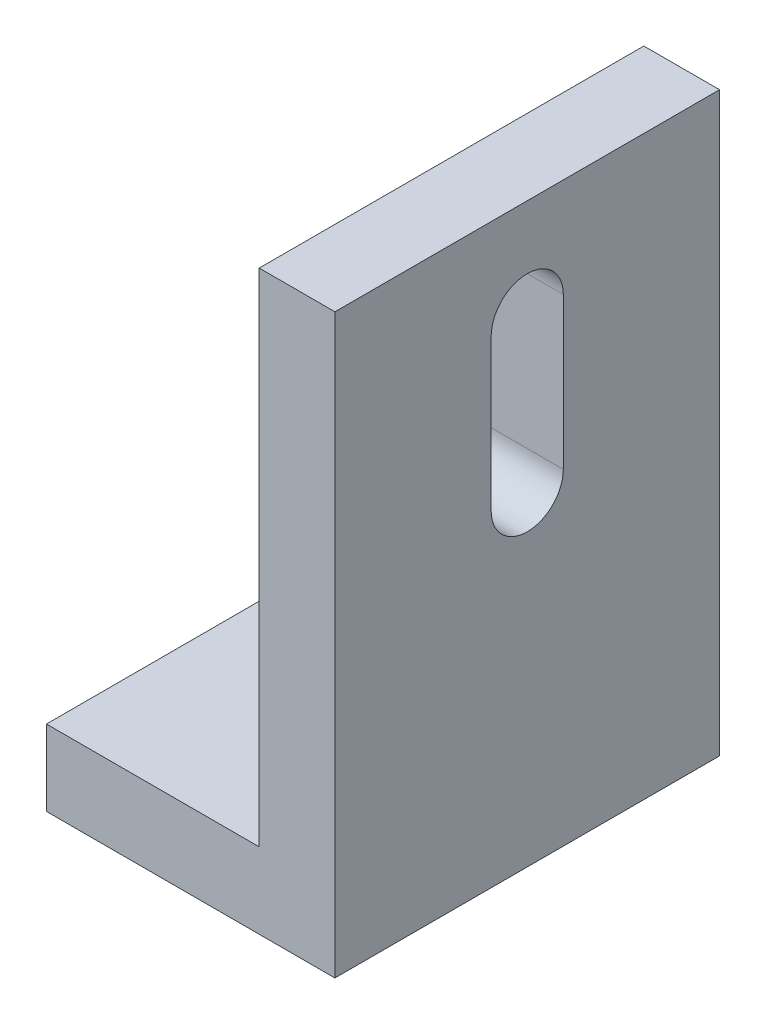
ISO-10303-21;
HEADER;
FILE_DESCRIPTION(('STEP AP214'),'2;1');
FILE_NAME('part.step','',(''),(''),'','','');
FILE_SCHEMA(('AUTOMOTIVE_DESIGN { 1 0 10303 214 1 1 1 1 }'));
ENDSEC;
DATA;
#1=APPLICATION_CONTEXT('core data for automotive mechanical design processes');
#2=APPLICATION_PROTOCOL_DEFINITION('international standard','automotive_design',2000,#1);
#3=PRODUCT_CONTEXT('',#1,'mechanical');
#4=PRODUCT('Part','Part','',(#3));
#5=PRODUCT_RELATED_PRODUCT_CATEGORY('part','',(#4));
#6=PRODUCT_DEFINITION_FORMATION('','',#4);
#7=PRODUCT_DEFINITION_CONTEXT('part definition',#1,'design');
#8=PRODUCT_DEFINITION('design','',#6,#7);
#9=PRODUCT_DEFINITION_SHAPE('','',#8);
#10=(LENGTH_UNIT() NAMED_UNIT(*) SI_UNIT(.MILLI.,.METRE.));
#11=(NAMED_UNIT(*) PLANE_ANGLE_UNIT() SI_UNIT($,.RADIAN.));
#12=(NAMED_UNIT(*) SI_UNIT($,.STERADIAN.) SOLID_ANGLE_UNIT());
#13=UNCERTAINTY_MEASURE_WITH_UNIT(LENGTH_MEASURE(1.E-05),#10,'distance_accuracy_value','');
#14=(GEOMETRIC_REPRESENTATION_CONTEXT(3) GLOBAL_UNCERTAINTY_ASSIGNED_CONTEXT((#13)) GLOBAL_UNIT_ASSIGNED_CONTEXT((#10,
#11,#12)) REPRESENTATION_CONTEXT('',''));
#15=CARTESIAN_POINT('',(0.,0.,0.));
#16=DIRECTION('',(0.,0.,1.));
#17=DIRECTION('',(1.,0.,0.));
#18=AXIS2_PLACEMENT_3D('',#15,#16,#17);
#19=CARTESIAN_POINT('',(38.1,0.,25.4));
#20=DIRECTION('',(-1.,0.,0.));
#21=DIRECTION('',(0.,0.,1.));
#22=AXIS2_PLACEMENT_3D('',#19,#20,#21);
#23=PLANE('',#22);
#24=DIRECTION('',(0.,-1.,0.));
#25=VECTOR('',#24,1.);
#26=CARTESIAN_POINT('',(38.1,43.1,-4.7625));
#27=LINE('',#26,#25);
#28=CARTESIAN_POINT('',(38.1,63.1,-4.7625));
#29=VERTEX_POINT('',#28);
#30=CARTESIAN_POINT('',(38.1,43.1,-4.7625));
#31=VERTEX_POINT('',#30);
#32=EDGE_CURVE('E117',#29,#31,#27,.T.);
#33=ORIENTED_EDGE('',*,*,#32,.T.);
#34=CARTESIAN_POINT('',(38.1,43.1,0.));
#35=DIRECTION('',(-1.,0.,0.));
#36=DIRECTION('',(0.,0.,1.));
#37=AXIS2_PLACEMENT_3D('',#34,#35,#36);
#38=CIRCLE('',#37,4.7625);
#39=CARTESIAN_POINT('',(38.1,43.1,4.7625));
#40=VERTEX_POINT('',#39);
#41=EDGE_CURVE('E111',#31,#40,#38,.T.);
#42=ORIENTED_EDGE('',*,*,#41,.T.);
#43=DIRECTION('',(0.,1.,0.));
#44=VECTOR('',#43,1.);
#45=CARTESIAN_POINT('',(38.1,43.1,4.7625));
#46=LINE('',#45,#44);
#47=CARTESIAN_POINT('',(38.1,63.1,4.7625));
#48=VERTEX_POINT('',#47);
#49=EDGE_CURVE('E120',#40,#48,#46,.T.);
#50=ORIENTED_EDGE('',*,*,#49,.T.);
#51=CARTESIAN_POINT('',(38.1,63.1,0.));
#52=DIRECTION('',(-1.,0.,0.));
#53=DIRECTION('',(0.,0.,1.));
#54=AXIS2_PLACEMENT_3D('',#51,#52,#53);
#55=CIRCLE('',#54,4.7625);
#56=EDGE_CURVE('E48',#48,#29,#55,.T.);
#57=ORIENTED_EDGE('',*,*,#56,.T.);
#58=EDGE_LOOP('',(#33,#42,#50,#57));
#59=FACE_BOUND('',#58,.T.);
#60=DIRECTION('',(0.,1.,0.));
#61=VECTOR('',#60,1.);
#62=CARTESIAN_POINT('',(38.1,0.,-25.4));
#63=LINE('',#62,#61);
#64=CARTESIAN_POINT('',(38.1,0.,-25.4));
#65=VERTEX_POINT('',#64);
#66=CARTESIAN_POINT('',(38.1,76.2,-25.4));
#67=VERTEX_POINT('',#66);
#68=EDGE_CURVE('E148',#65,#67,#63,.T.);
#69=ORIENTED_EDGE('',*,*,#68,.T.);
#70=DIRECTION('',(0.,0.,-1.));
#71=VECTOR('',#70,1.);
#72=CARTESIAN_POINT('',(38.1,76.2,25.4));
#73=LINE('',#72,#71);
#74=CARTESIAN_POINT('',(38.1,76.2,25.4));
#75=VERTEX_POINT('',#74);
#76=EDGE_CURVE('E11',#75,#67,#73,.T.);
#77=ORIENTED_EDGE('',*,*,#76,.F.);
#78=DIRECTION('',(0.,1.,0.));
#79=VECTOR('',#78,1.);
#80=CARTESIAN_POINT('',(38.1,0.,25.4));
#81=LINE('',#80,#79);
#82=CARTESIAN_POINT('',(38.1,0.,25.4));
#83=VERTEX_POINT('',#82);
#84=EDGE_CURVE('E151',#83,#75,#81,.T.);
#85=ORIENTED_EDGE('',*,*,#84,.F.);
#86=DIRECTION('',(0.,0.,-1.));
#87=VECTOR('',#86,1.);
#88=CARTESIAN_POINT('',(38.1,0.,25.4));
#89=LINE('',#88,#87);
#90=EDGE_CURVE('E168',#83,#65,#89,.T.);
#91=ORIENTED_EDGE('',*,*,#90,.T.);
#92=EDGE_LOOP('',(#69,#77,#85,#91));
#93=FACE_BOUND('',#92,.T.);
#94=ADVANCED_FACE('F34',(#59,#93),#23,.F.);
#95=CARTESIAN_POINT('',(28.1,76.2,25.4));
#96=DIRECTION('',(0.,1.,0.));
#97=DIRECTION('',(0.,0.,1.));
#98=AXIS2_PLACEMENT_3D('',#95,#96,#97);
#99=PLANE('',#98);
#100=DIRECTION('',(1.,0.,0.));
#101=VECTOR('',#100,1.);
#102=CARTESIAN_POINT('',(28.1,76.2,-25.4));
#103=LINE('',#102,#101);
#104=CARTESIAN_POINT('',(28.1,76.2,-25.4));
#105=VERTEX_POINT('',#104);
#106=EDGE_CURVE('E171',#105,#67,#103,.T.);
#107=ORIENTED_EDGE('',*,*,#106,.F.);
#108=DIRECTION('',(0.,0.,-1.));
#109=VECTOR('',#108,1.);
#110=CARTESIAN_POINT('',(28.1,76.2,25.4));
#111=LINE('',#110,#109);
#112=CARTESIAN_POINT('',(28.1,76.2,25.4));
#113=VERTEX_POINT('',#112);
#114=EDGE_CURVE('E41',#113,#105,#111,.T.);
#115=ORIENTED_EDGE('',*,*,#114,.F.);
#116=DIRECTION('',(1.,0.,0.));
#117=VECTOR('',#116,1.);
#118=CARTESIAN_POINT('',(28.1,76.2,25.4));
#119=LINE('',#118,#117);
#120=EDGE_CURVE('E153',#113,#75,#119,.T.);
#121=ORIENTED_EDGE('',*,*,#120,.T.);
#122=ORIENTED_EDGE('',*,*,#76,.T.);
#123=EDGE_LOOP('',(#107,#115,#121,#122));
#124=FACE_BOUND('',#123,.T.);
#125=ADVANCED_FACE('F198',(#124),#99,.T.);
#126=CARTESIAN_POINT('',(28.1,0.,25.4));
#127=DIRECTION('',(-1.,0.,0.));
#128=DIRECTION('',(0.,0.,1.));
#129=AXIS2_PLACEMENT_3D('',#126,#127,#128);
#130=PLANE('',#129);
#131=CARTESIAN_POINT('',(28.1,43.1,0.));
#132=DIRECTION('',(-1.,0.,0.));
#133=DIRECTION('',(0.,0.,1.));
#134=AXIS2_PLACEMENT_3D('',#131,#132,#133);
#135=CIRCLE('',#134,4.7625);
#136=CARTESIAN_POINT('',(28.1,43.1,-4.7625));
#137=VERTEX_POINT('',#136);
#138=CARTESIAN_POINT('',(28.1,43.1,4.7625));
#139=VERTEX_POINT('',#138);
#140=EDGE_CURVE('E56',#137,#139,#135,.T.);
#141=ORIENTED_EDGE('',*,*,#140,.F.);
#142=DIRECTION('',(0.,-1.,0.));
#143=VECTOR('',#142,1.);
#144=CARTESIAN_POINT('',(28.1,43.1,-4.7625));
#145=LINE('',#144,#143);
#146=CARTESIAN_POINT('',(28.1,63.1,-4.7625));
#147=VERTEX_POINT('',#146);
#148=EDGE_CURVE('E126',#147,#137,#145,.T.);
#149=ORIENTED_EDGE('',*,*,#148,.F.);
#150=CARTESIAN_POINT('',(28.1,63.1,0.));
#151=DIRECTION('',(-1.,0.,0.));
#152=DIRECTION('',(0.,0.,1.));
#153=AXIS2_PLACEMENT_3D('',#150,#151,#152);
#154=CIRCLE('',#153,4.7625);
#155=CARTESIAN_POINT('',(28.1,63.1,4.7625));
#156=VERTEX_POINT('',#155);
#157=EDGE_CURVE('E129',#156,#147,#154,.T.);
#158=ORIENTED_EDGE('',*,*,#157,.F.);
#159=DIRECTION('',(0.,1.,0.));
#160=VECTOR('',#159,1.);
#161=CARTESIAN_POINT('',(28.1,43.1,4.7625));
#162=LINE('',#161,#160);
#163=EDGE_CURVE('E135',#139,#156,#162,.T.);
#164=ORIENTED_EDGE('',*,*,#163,.F.);
#165=EDGE_LOOP('',(#141,#149,#158,#164));
#166=FACE_BOUND('',#165,.T.);
#167=DIRECTION('',(0.,1.,0.));
#168=VECTOR('',#167,1.);
#169=CARTESIAN_POINT('',(28.1,0.,-25.4));
#170=LINE('',#169,#168);
#171=CARTESIAN_POINT('',(28.1,10.,-25.4));
#172=VERTEX_POINT('',#171);
#173=EDGE_CURVE('E174',#172,#105,#170,.T.);
#174=ORIENTED_EDGE('',*,*,#173,.F.);
#175=DIRECTION('',(0.,0.,-1.));
#176=VECTOR('',#175,1.);
#177=CARTESIAN_POINT('',(28.1,10.,25.4));
#178=LINE('',#177,#176);
#179=CARTESIAN_POINT('',(28.1,10.,25.4));
#180=VERTEX_POINT('',#179);
#181=EDGE_CURVE('E190',#180,#172,#178,.T.);
#182=ORIENTED_EDGE('',*,*,#181,.F.);
#183=DIRECTION('',(0.,1.,0.));
#184=VECTOR('',#183,1.);
#185=CARTESIAN_POINT('',(28.1,0.,25.4));
#186=LINE('',#185,#184);
#187=EDGE_CURVE('E157',#180,#113,#186,.T.);
#188=ORIENTED_EDGE('',*,*,#187,.T.);
#189=ORIENTED_EDGE('',*,*,#114,.T.);
#190=EDGE_LOOP('',(#174,#182,#188,#189));
#191=FACE_BOUND('',#190,.T.);
#192=ADVANCED_FACE('F194',(#166,#191),#130,.T.);
#193=CARTESIAN_POINT('',(0.,10.,25.4));
#194=DIRECTION('',(0.,1.,0.));
#195=DIRECTION('',(0.,0.,1.));
#196=AXIS2_PLACEMENT_3D('',#193,#194,#195);
#197=PLANE('',#196);
#198=CARTESIAN_POINT('',(14.05,10.,0.));
#199=DIRECTION('',(0.,1.,0.));
#200=DIRECTION('',(0.,0.,1.));
#201=AXIS2_PLACEMENT_3D('',#198,#199,#200);
#202=CIRCLE('',#201,4.7625);
#203=CARTESIAN_POINT('',(14.05,10.,4.7625));
#204=VERTEX_POINT('',#203);
#205=EDGE_CURVE('E141',#204,#204,#202,.T.);
#206=ORIENTED_EDGE('',*,*,#205,.F.);
#207=EDGE_LOOP('',(#206));
#208=FACE_BOUND('',#207,.T.);
#209=DIRECTION('',(1.,0.,0.));
#210=VECTOR('',#209,1.);
#211=CARTESIAN_POINT('',(0.,10.,-25.4));
#212=LINE('',#211,#210);
#213=CARTESIAN_POINT('',(0.,10.,-25.4));
#214=VERTEX_POINT('',#213);
#215=EDGE_CURVE('E177',#214,#172,#212,.T.);
#216=ORIENTED_EDGE('',*,*,#215,.F.);
#217=DIRECTION('',(0.,0.,-1.));
#218=VECTOR('',#217,1.);
#219=CARTESIAN_POINT('',(0.,10.,25.4));
#220=LINE('',#219,#218);
#221=CARTESIAN_POINT('',(0.,10.,25.4));
#222=VERTEX_POINT('',#221);
#223=EDGE_CURVE('E188',#222,#214,#220,.T.);
#224=ORIENTED_EDGE('',*,*,#223,.F.);
#225=DIRECTION('',(1.,0.,0.));
#226=VECTOR('',#225,1.);
#227=CARTESIAN_POINT('',(0.,10.,25.4));
#228=LINE('',#227,#226);
#229=EDGE_CURVE('E160',#222,#180,#228,.T.);
#230=ORIENTED_EDGE('',*,*,#229,.T.);
#231=ORIENTED_EDGE('',*,*,#181,.T.);
#232=EDGE_LOOP('',(#216,#224,#230,#231));
#233=FACE_BOUND('',#232,.T.);
#234=ADVANCED_FACE('F207',(#208,#233),#197,.T.);
#235=CARTESIAN_POINT('',(0.,0.,25.4));
#236=DIRECTION('',(-1.,0.,0.));
#237=DIRECTION('',(0.,0.,1.));
#238=AXIS2_PLACEMENT_3D('',#235,#236,#237);
#239=PLANE('',#238);
#240=DIRECTION('',(0.,1.,0.));
#241=VECTOR('',#240,1.);
#242=CARTESIAN_POINT('',(0.,0.,-25.4));
#243=LINE('',#242,#241);
#244=CARTESIAN_POINT('',(0.,0.,-25.4));
#245=VERTEX_POINT('',#244);
#246=EDGE_CURVE('E180',#245,#214,#243,.T.);
#247=ORIENTED_EDGE('',*,*,#246,.F.);
#248=DIRECTION('',(0.,0.,-1.));
#249=VECTOR('',#248,1.);
#250=CARTESIAN_POINT('',(0.,0.,25.4));
#251=LINE('',#250,#249);
#252=CARTESIAN_POINT('',(0.,0.,25.4));
#253=VERTEX_POINT('',#252);
#254=EDGE_CURVE('E186',#253,#245,#251,.T.);
#255=ORIENTED_EDGE('',*,*,#254,.F.);
#256=DIRECTION('',(0.,1.,0.));
#257=VECTOR('',#256,1.);
#258=CARTESIAN_POINT('',(0.,0.,25.4));
#259=LINE('',#258,#257);
#260=EDGE_CURVE('E163',#253,#222,#259,.T.);
#261=ORIENTED_EDGE('',*,*,#260,.T.);
#262=ORIENTED_EDGE('',*,*,#223,.T.);
#263=EDGE_LOOP('',(#247,#255,#261,#262));
#264=FACE_BOUND('',#263,.T.);
#265=ADVANCED_FACE('F217',(#264),#239,.T.);
#266=CARTESIAN_POINT('',(0.,0.,25.4));
#267=DIRECTION('',(0.,1.,0.));
#268=DIRECTION('',(0.,0.,1.));
#269=AXIS2_PLACEMENT_3D('',#266,#267,#268);
#270=PLANE('',#269);
#271=CARTESIAN_POINT('',(14.05,0.,0.));
#272=DIRECTION('',(0.,1.,0.));
#273=DIRECTION('',(0.,0.,1.));
#274=AXIS2_PLACEMENT_3D('',#271,#272,#273);
#275=CIRCLE('',#274,4.7625);
#276=CARTESIAN_POINT('',(14.05,0.,4.7625));
#277=VERTEX_POINT('',#276);
#278=EDGE_CURVE('E145',#277,#277,#275,.T.);
#279=ORIENTED_EDGE('',*,*,#278,.T.);
#280=EDGE_LOOP('',(#279));
#281=FACE_BOUND('',#280,.T.);
#282=DIRECTION('',(1.,0.,0.));
#283=VECTOR('',#282,1.);
#284=CARTESIAN_POINT('',(0.,0.,-25.4));
#285=LINE('',#284,#283);
#286=EDGE_CURVE('E154',#245,#65,#285,.T.);
#287=ORIENTED_EDGE('',*,*,#286,.T.);
#288=ORIENTED_EDGE('',*,*,#90,.F.);
#289=DIRECTION('',(1.,0.,0.));
#290=VECTOR('',#289,1.);
#291=CARTESIAN_POINT('',(0.,0.,25.4));
#292=LINE('',#291,#290);
#293=EDGE_CURVE('E166',#253,#83,#292,.T.);
#294=ORIENTED_EDGE('',*,*,#293,.F.);
#295=ORIENTED_EDGE('',*,*,#254,.T.);
#296=EDGE_LOOP('',(#287,#288,#294,#295));
#297=FACE_BOUND('',#296,.T.);
#298=ADVANCED_FACE('F218',(#281,#297),#270,.F.);
#299=CARTESIAN_POINT('',(0.,0.,25.4));
#300=DIRECTION('',(0.,0.,-1.));
#301=DIRECTION('',(-1.,0.,0.));
#302=AXIS2_PLACEMENT_3D('',#299,#300,#301);
#303=PLANE('',#302);
#304=ORIENTED_EDGE('',*,*,#84,.T.);
#305=ORIENTED_EDGE('',*,*,#120,.F.);
#306=ORIENTED_EDGE('',*,*,#187,.F.);
#307=ORIENTED_EDGE('',*,*,#229,.F.);
#308=ORIENTED_EDGE('',*,*,#260,.F.);
#309=ORIENTED_EDGE('',*,*,#293,.T.);
#310=EDGE_LOOP('',(#304,#305,#306,#307,#308,#309));
#311=FACE_BOUND('',#310,.T.);
#312=ADVANCED_FACE('F210',(#311),#303,.F.);
#313=CARTESIAN_POINT('',(0.,0.,-25.4));
#314=DIRECTION('',(0.,0.,-1.));
#315=DIRECTION('',(-1.,0.,0.));
#316=AXIS2_PLACEMENT_3D('',#313,#314,#315);
#317=PLANE('',#316);
#318=ORIENTED_EDGE('',*,*,#68,.F.);
#319=ORIENTED_EDGE('',*,*,#286,.F.);
#320=ORIENTED_EDGE('',*,*,#246,.T.);
#321=ORIENTED_EDGE('',*,*,#215,.T.);
#322=ORIENTED_EDGE('',*,*,#173,.T.);
#323=ORIENTED_EDGE('',*,*,#106,.T.);
#324=EDGE_LOOP('',(#318,#319,#320,#321,#322,#323));
#325=FACE_BOUND('',#324,.T.);
#326=ADVANCED_FACE('F202',(#325),#317,.T.);
#327=CARTESIAN_POINT('',(14.05,0.,0.));
#328=DIRECTION('',(0.,1.,0.));
#329=DIRECTION('',(0.,0.,1.));
#330=AXIS2_PLACEMENT_3D('',#327,#328,#329);
#331=CYLINDRICAL_SURFACE('',#330,4.7625);
#332=ORIENTED_EDGE('',*,*,#278,.F.);
#333=EDGE_LOOP('',(#332));
#334=FACE_BOUND('',#333,.T.);
#335=ORIENTED_EDGE('',*,*,#205,.T.);
#336=EDGE_LOOP('',(#335));
#337=FACE_BOUND('',#336,.T.);
#338=ADVANCED_FACE('F245',(#334,#337),#331,.F.);
#339=CARTESIAN_POINT('',(38.1,43.1,0.));
#340=DIRECTION('',(-1.,0.,0.));
#341=DIRECTION('',(0.,0.,1.));
#342=AXIS2_PLACEMENT_3D('',#339,#340,#341);
#343=CYLINDRICAL_SURFACE('',#342,4.7625);
#344=ORIENTED_EDGE('',*,*,#140,.T.);
#345=DIRECTION('',(-1.,0.,0.));
#346=VECTOR('',#345,1.);
#347=CARTESIAN_POINT('',(38.1,43.1,4.7625));
#348=LINE('',#347,#346);
#349=EDGE_CURVE('E107',#40,#139,#348,.T.);
#350=ORIENTED_EDGE('',*,*,#349,.F.);
#351=ORIENTED_EDGE('',*,*,#41,.F.);
#352=DIRECTION('',(-1.,0.,0.));
#353=VECTOR('',#352,1.);
#354=CARTESIAN_POINT('',(38.1,43.1,-4.7625));
#355=LINE('',#354,#353);
#356=EDGE_CURVE('E139',#31,#137,#355,.T.);
#357=ORIENTED_EDGE('',*,*,#356,.T.);
#358=EDGE_LOOP('',(#344,#350,#351,#357));
#359=FACE_BOUND('',#358,.T.);
#360=ADVANCED_FACE('F109',(#359),#343,.F.);
#361=CARTESIAN_POINT('',(38.1,43.1,-4.7625));
#362=DIRECTION('',(0.,0.,-1.));
#363=DIRECTION('',(0.,1.,0.));
#364=AXIS2_PLACEMENT_3D('',#361,#362,#363);
#365=PLANE('',#364);
#366=ORIENTED_EDGE('',*,*,#148,.T.);
#367=ORIENTED_EDGE('',*,*,#356,.F.);
#368=ORIENTED_EDGE('',*,*,#32,.F.);
#369=DIRECTION('',(-1.,0.,0.));
#370=VECTOR('',#369,1.);
#371=CARTESIAN_POINT('',(38.1,63.1,-4.7625));
#372=LINE('',#371,#370);
#373=EDGE_CURVE('E142',#29,#147,#372,.T.);
#374=ORIENTED_EDGE('',*,*,#373,.T.);
#375=EDGE_LOOP('',(#366,#367,#368,#374));
#376=FACE_BOUND('',#375,.T.);
#377=ADVANCED_FACE('F253',(#376),#365,.F.);
#378=CARTESIAN_POINT('',(38.1,63.1,0.));
#379=DIRECTION('',(-1.,0.,0.));
#380=DIRECTION('',(0.,0.,1.));
#381=AXIS2_PLACEMENT_3D('',#378,#379,#380);
#382=CYLINDRICAL_SURFACE('',#381,4.7625);
#383=ORIENTED_EDGE('',*,*,#157,.T.);
#384=ORIENTED_EDGE('',*,*,#373,.F.);
#385=ORIENTED_EDGE('',*,*,#56,.F.);
#386=DIRECTION('',(-1.,0.,0.));
#387=VECTOR('',#386,1.);
#388=CARTESIAN_POINT('',(38.1,63.1,4.7625));
#389=LINE('',#388,#387);
#390=EDGE_CURVE('E116',#48,#156,#389,.T.);
#391=ORIENTED_EDGE('',*,*,#390,.T.);
#392=EDGE_LOOP('',(#383,#384,#385,#391));
#393=FACE_BOUND('',#392,.T.);
#394=ADVANCED_FACE('F259',(#393),#382,.F.);
#395=CARTESIAN_POINT('',(38.1,43.1,4.7625));
#396=DIRECTION('',(0.,0.,1.));
#397=DIRECTION('',(0.,-1.,0.));
#398=AXIS2_PLACEMENT_3D('',#395,#396,#397);
#399=PLANE('',#398);
#400=ORIENTED_EDGE('',*,*,#163,.T.);
#401=ORIENTED_EDGE('',*,*,#390,.F.);
#402=ORIENTED_EDGE('',*,*,#49,.F.);
#403=ORIENTED_EDGE('',*,*,#349,.T.);
#404=EDGE_LOOP('',(#400,#401,#402,#403));
#405=FACE_BOUND('',#404,.T.);
#406=ADVANCED_FACE('F121',(#405),#399,.F.);
#407=CLOSED_SHELL('',(#94,#125,#192,#234,#265,#298,#312,#326,#338,#360,#377,#394,#406));
#408=MANIFOLD_SOLID_BREP('B2',#407);
#409=ADVANCED_BREP_SHAPE_REPRESENTATION('',(#18,#408),#14);
#410=SHAPE_DEFINITION_REPRESENTATION(#9,#409);
ENDSEC;
END-ISO-10303-21;
